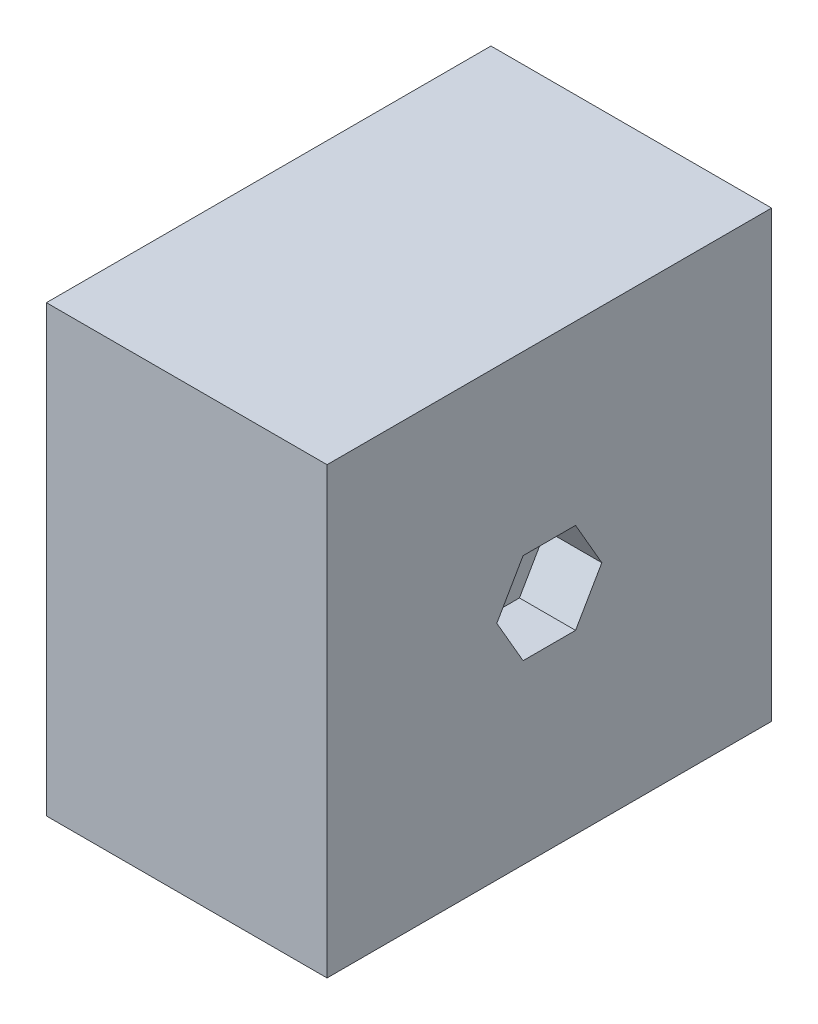
ISO-10303-21;
HEADER;
FILE_DESCRIPTION(('STEP AP214'),'2;1');
FILE_NAME('part.step','',(''),(''),'','','');
FILE_SCHEMA(('AUTOMOTIVE_DESIGN { 1 0 10303 214 1 1 1 1 }'));
ENDSEC;
DATA;
#1=APPLICATION_CONTEXT('core data for automotive mechanical design processes');
#2=APPLICATION_PROTOCOL_DEFINITION('international standard','automotive_design',2000,#1);
#3=PRODUCT_CONTEXT('',#1,'mechanical');
#4=PRODUCT('Part','Part','',(#3));
#5=PRODUCT_RELATED_PRODUCT_CATEGORY('part','',(#4));
#6=PRODUCT_DEFINITION_FORMATION('','',#4);
#7=PRODUCT_DEFINITION_CONTEXT('part definition',#1,'design');
#8=PRODUCT_DEFINITION('design','',#6,#7);
#9=PRODUCT_DEFINITION_SHAPE('','',#8);
#10=(LENGTH_UNIT() NAMED_UNIT(*) SI_UNIT(.MILLI.,.METRE.));
#11=(NAMED_UNIT(*) PLANE_ANGLE_UNIT() SI_UNIT($,.RADIAN.));
#12=(NAMED_UNIT(*) SI_UNIT($,.STERADIAN.) SOLID_ANGLE_UNIT());
#13=UNCERTAINTY_MEASURE_WITH_UNIT(LENGTH_MEASURE(1.E-05),#10,'distance_accuracy_value','');
#14=(GEOMETRIC_REPRESENTATION_CONTEXT(3) GLOBAL_UNCERTAINTY_ASSIGNED_CONTEXT((#13)) GLOBAL_UNIT_ASSIGNED_CONTEXT((#10,
#11,#12)) REPRESENTATION_CONTEXT('',''));
#15=CARTESIAN_POINT('',(0.,0.,0.));
#16=DIRECTION('',(0.,0.,1.));
#17=DIRECTION('',(1.,0.,0.));
#18=AXIS2_PLACEMENT_3D('',#15,#16,#17);
#19=CARTESIAN_POINT('',(25.,0.,0.));
#20=DIRECTION('',(1.,0.,0.));
#21=DIRECTION('',(0.,0.,-1.));
#22=AXIS2_PLACEMENT_3D('',#19,#20,#21);
#23=PLANE('',#22);
#24=DIRECTION('',(0.,1.,0.));
#25=VECTOR('',#24,1.);
#26=CARTESIAN_POINT('',(25.,19.8,-19.8));
#27=LINE('',#26,#25);
#28=CARTESIAN_POINT('',(25.,-19.8,-19.8));
#29=VERTEX_POINT('',#28);
#30=CARTESIAN_POINT('',(25.,19.8,-19.8));
#31=VERTEX_POINT('',#30);
#32=EDGE_CURVE('E222',#29,#31,#27,.T.);
#33=ORIENTED_EDGE('',*,*,#32,.T.);
#34=DIRECTION('',(0.,0.,1.));
#35=VECTOR('',#34,1.);
#36=CARTESIAN_POINT('',(25.,19.8,19.8));
#37=LINE('',#36,#35);
#38=CARTESIAN_POINT('',(25.,19.8,19.8));
#39=VERTEX_POINT('',#38);
#40=EDGE_CURVE('E225',#31,#39,#37,.T.);
#41=ORIENTED_EDGE('',*,*,#40,.T.);
#42=DIRECTION('',(0.,-1.,0.));
#43=VECTOR('',#42,1.);
#44=CARTESIAN_POINT('',(25.,19.8,19.8));
#45=LINE('',#44,#43);
#46=CARTESIAN_POINT('',(25.,-19.8,19.8));
#47=VERTEX_POINT('',#46);
#48=EDGE_CURVE('E228',#39,#47,#45,.T.);
#49=ORIENTED_EDGE('',*,*,#48,.T.);
#50=DIRECTION('',(0.,0.,-1.));
#51=VECTOR('',#50,1.);
#52=CARTESIAN_POINT('',(25.,-19.8,19.8));
#53=LINE('',#52,#51);
#54=EDGE_CURVE('E230',#47,#29,#53,.T.);
#55=ORIENTED_EDGE('',*,*,#54,.T.);
#56=EDGE_LOOP('',(#33,#41,#49,#55));
#57=FACE_BOUND('',#56,.T.);
#58=DIRECTION('',(0.,0.,1.));
#59=VECTOR('',#58,1.);
#60=CARTESIAN_POINT('',(25.,-4.05,0.));
#61=LINE('',#60,#59);
#62=CARTESIAN_POINT('',(25.,-4.05,-2.33826859021798));
#63=VERTEX_POINT('',#62);
#64=CARTESIAN_POINT('',(25.,-4.05,2.33826859021798));
#65=VERTEX_POINT('',#64);
#66=EDGE_CURVE('E167',#63,#65,#61,.T.);
#67=ORIENTED_EDGE('',*,*,#66,.T.);
#68=DIRECTION('',(0.,0.866025403784439,0.5));
#69=VECTOR('',#68,1.);
#70=CARTESIAN_POINT('',(25.,-2.025,3.50740288532698));
#71=LINE('',#70,#69);
#72=CARTESIAN_POINT('',(25.,0.,4.67653718043597));
#73=VERTEX_POINT('',#72);
#74=EDGE_CURVE('E50',#65,#73,#71,.T.);
#75=ORIENTED_EDGE('',*,*,#74,.T.);
#76=DIRECTION('',(0.,0.866025403784439,-0.5));
#77=VECTOR('',#76,1.);
#78=CARTESIAN_POINT('',(25.,2.025,3.50740288532698));
#79=LINE('',#78,#77);
#80=CARTESIAN_POINT('',(25.,4.05,2.33826859021798));
#81=VERTEX_POINT('',#80);
#82=EDGE_CURVE('E171',#73,#81,#79,.T.);
#83=ORIENTED_EDGE('',*,*,#82,.T.);
#84=DIRECTION('',(0.,0.,-1.));
#85=VECTOR('',#84,1.);
#86=CARTESIAN_POINT('',(25.,4.05,0.));
#87=LINE('',#86,#85);
#88=CARTESIAN_POINT('',(25.,4.05,-2.33826859021798));
#89=VERTEX_POINT('',#88);
#90=EDGE_CURVE('E485',#81,#89,#87,.T.);
#91=ORIENTED_EDGE('',*,*,#90,.T.);
#92=DIRECTION('',(0.,-0.866025403784439,-0.5));
#93=VECTOR('',#92,1.);
#94=CARTESIAN_POINT('',(25.,2.025,-3.50740288532698));
#95=LINE('',#94,#93);
#96=CARTESIAN_POINT('',(25.,0.,-4.67653718043597));
#97=VERTEX_POINT('',#96);
#98=EDGE_CURVE('E482',#89,#97,#95,.T.);
#99=ORIENTED_EDGE('',*,*,#98,.T.);
#100=DIRECTION('',(0.,-0.866025403784439,0.5));
#101=VECTOR('',#100,1.);
#102=CARTESIAN_POINT('',(25.,-2.025,-3.50740288532698));
#103=LINE('',#102,#101);
#104=EDGE_CURVE('E476',#97,#63,#103,.T.);
#105=ORIENTED_EDGE('',*,*,#104,.T.);
#106=EDGE_LOOP('',(#67,#75,#83,#91,#99,#105));
#107=FACE_BOUND('',#106,.T.);
#108=ADVANCED_FACE('F33',(#57,#107),#23,.T.);
#109=CARTESIAN_POINT('',(0.,0.,0.));
#110=DIRECTION('',(1.,0.,0.));
#111=DIRECTION('',(0.,0.,-1.));
#112=AXIS2_PLACEMENT_3D('',#109,#110,#111);
#113=PLANE('',#112);
#114=DIRECTION('',(0.,1.,0.));
#115=VECTOR('',#114,1.);
#116=CARTESIAN_POINT('',(0.,19.8,-19.8));
#117=LINE('',#116,#115);
#118=CARTESIAN_POINT('',(0.,-19.8,-19.8));
#119=VERTEX_POINT('',#118);
#120=CARTESIAN_POINT('',(0.,19.8,-19.8));
#121=VERTEX_POINT('',#120);
#122=EDGE_CURVE('E221',#119,#121,#117,.T.);
#123=ORIENTED_EDGE('',*,*,#122,.F.);
#124=DIRECTION('',(0.,0.,-1.));
#125=VECTOR('',#124,1.);
#126=CARTESIAN_POINT('',(0.,-19.8,19.8));
#127=LINE('',#126,#125);
#128=CARTESIAN_POINT('',(0.,-19.8,19.8));
#129=VERTEX_POINT('',#128);
#130=EDGE_CURVE('E226',#129,#119,#127,.T.);
#131=ORIENTED_EDGE('',*,*,#130,.F.);
#132=DIRECTION('',(0.,-1.,0.));
#133=VECTOR('',#132,1.);
#134=CARTESIAN_POINT('',(0.,19.8,19.8));
#135=LINE('',#134,#133);
#136=CARTESIAN_POINT('',(0.,19.8,19.8));
#137=VERTEX_POINT('',#136);
#138=EDGE_CURVE('E237',#137,#129,#135,.T.);
#139=ORIENTED_EDGE('',*,*,#138,.F.);
#140=DIRECTION('',(0.,0.,1.));
#141=VECTOR('',#140,1.);
#142=CARTESIAN_POINT('',(0.,19.8,19.8));
#143=LINE('',#142,#141);
#144=EDGE_CURVE('E235',#121,#137,#143,.T.);
#145=ORIENTED_EDGE('',*,*,#144,.F.);
#146=EDGE_LOOP('',(#123,#131,#139,#145));
#147=FACE_BOUND('',#146,.T.);
#148=DIRECTION('',(0.,0.866025403784439,-0.5));
#149=VECTOR('',#148,1.);
#150=CARTESIAN_POINT('',(0.,-4.05,-2.33826859021799));
#151=LINE('',#150,#149);
#152=CARTESIAN_POINT('',(0.,-4.05,-2.33826859021799));
#153=VERTEX_POINT('',#152);
#154=CARTESIAN_POINT('',(0.,0.,-4.67653718043597));
#155=VERTEX_POINT('',#154);
#156=EDGE_CURVE('E58',#153,#155,#151,.T.);
#157=ORIENTED_EDGE('',*,*,#156,.T.);
#158=DIRECTION('',(0.,0.866025403784438,0.5));
#159=VECTOR('',#158,1.);
#160=CARTESIAN_POINT('',(0.,0.,-4.67653718043597));
#161=LINE('',#160,#159);
#162=CARTESIAN_POINT('',(0.,4.05,-2.33826859021798));
#163=VERTEX_POINT('',#162);
#164=EDGE_CURVE('E196',#155,#163,#161,.T.);
#165=ORIENTED_EDGE('',*,*,#164,.T.);
#166=DIRECTION('',(0.,0.,1.));
#167=VECTOR('',#166,1.);
#168=CARTESIAN_POINT('',(0.,4.05,-2.33826859021798));
#169=LINE('',#168,#167);
#170=CARTESIAN_POINT('',(0.,4.05,2.33826859021798));
#171=VERTEX_POINT('',#170);
#172=EDGE_CURVE('E199',#163,#171,#169,.T.);
#173=ORIENTED_EDGE('',*,*,#172,.T.);
#174=DIRECTION('',(0.,-0.866025403784439,0.5));
#175=VECTOR('',#174,1.);
#176=CARTESIAN_POINT('',(0.,4.05,2.33826859021798));
#177=LINE('',#176,#175);
#178=CARTESIAN_POINT('',(0.,0.,4.67653718043597));
#179=VERTEX_POINT('',#178);
#180=EDGE_CURVE('E202',#171,#179,#177,.T.);
#181=ORIENTED_EDGE('',*,*,#180,.T.);
#182=DIRECTION('',(0.,-0.866025403784438,-0.5));
#183=VECTOR('',#182,1.);
#184=CARTESIAN_POINT('',(0.,0.,4.67653718043597));
#185=LINE('',#184,#183);
#186=CARTESIAN_POINT('',(0.,-4.05,2.33826859021798));
#187=VERTEX_POINT('',#186);
#188=EDGE_CURVE('E205',#179,#187,#185,.T.);
#189=ORIENTED_EDGE('',*,*,#188,.T.);
#190=DIRECTION('',(0.,0.,-1.));
#191=VECTOR('',#190,1.);
#192=CARTESIAN_POINT('',(0.,-4.05,2.33826859021798));
#193=LINE('',#192,#191);
#194=EDGE_CURVE('E184',#187,#153,#193,.T.);
#195=ORIENTED_EDGE('',*,*,#194,.T.);
#196=EDGE_LOOP('',(#157,#165,#173,#181,#189,#195));
#197=FACE_BOUND('',#196,.T.);
#198=ADVANCED_FACE('F265',(#147,#197),#113,.F.);
#199=CARTESIAN_POINT('',(25.,19.8,-19.8));
#200=DIRECTION('',(0.,0.,1.));
#201=DIRECTION('',(0.,-1.,0.));
#202=AXIS2_PLACEMENT_3D('',#199,#200,#201);
#203=PLANE('',#202);
#204=ORIENTED_EDGE('',*,*,#122,.T.);
#205=DIRECTION('',(-1.,0.,0.));
#206=VECTOR('',#205,1.);
#207=CARTESIAN_POINT('',(25.,19.8,-19.8));
#208=LINE('',#207,#206);
#209=EDGE_CURVE('E11',#31,#121,#208,.T.);
#210=ORIENTED_EDGE('',*,*,#209,.F.);
#211=ORIENTED_EDGE('',*,*,#32,.F.);
#212=DIRECTION('',(-1.,0.,0.));
#213=VECTOR('',#212,1.);
#214=CARTESIAN_POINT('',(25.,-19.8,-19.8));
#215=LINE('',#214,#213);
#216=EDGE_CURVE('E232',#29,#119,#215,.T.);
#217=ORIENTED_EDGE('',*,*,#216,.T.);
#218=EDGE_LOOP('',(#204,#210,#211,#217));
#219=FACE_BOUND('',#218,.T.);
#220=ADVANCED_FACE('F35',(#219),#203,.F.);
#221=CARTESIAN_POINT('',(25.,19.8,19.8));
#222=DIRECTION('',(0.,-1.,0.));
#223=DIRECTION('',(0.,0.,-1.));
#224=AXIS2_PLACEMENT_3D('',#221,#222,#223);
#225=PLANE('',#224);
#226=ORIENTED_EDGE('',*,*,#144,.T.);
#227=DIRECTION('',(-1.,0.,0.));
#228=VECTOR('',#227,1.);
#229=CARTESIAN_POINT('',(25.,19.8,19.8));
#230=LINE('',#229,#228);
#231=EDGE_CURVE('E42',#39,#137,#230,.T.);
#232=ORIENTED_EDGE('',*,*,#231,.F.);
#233=ORIENTED_EDGE('',*,*,#40,.F.);
#234=ORIENTED_EDGE('',*,*,#209,.T.);
#235=EDGE_LOOP('',(#226,#232,#233,#234));
#236=FACE_BOUND('',#235,.T.);
#237=ADVANCED_FACE('F284',(#236),#225,.F.);
#238=CARTESIAN_POINT('',(25.,19.8,19.8));
#239=DIRECTION('',(0.,0.,-1.));
#240=DIRECTION('',(0.,1.,0.));
#241=AXIS2_PLACEMENT_3D('',#238,#239,#240);
#242=PLANE('',#241);
#243=ORIENTED_EDGE('',*,*,#138,.T.);
#244=DIRECTION('',(-1.,0.,0.));
#245=VECTOR('',#244,1.);
#246=CARTESIAN_POINT('',(25.,-19.8,19.8));
#247=LINE('',#246,#245);
#248=EDGE_CURVE('E242',#47,#129,#247,.T.);
#249=ORIENTED_EDGE('',*,*,#248,.F.);
#250=ORIENTED_EDGE('',*,*,#48,.F.);
#251=ORIENTED_EDGE('',*,*,#231,.T.);
#252=EDGE_LOOP('',(#243,#249,#250,#251));
#253=FACE_BOUND('',#252,.T.);
#254=ADVANCED_FACE('F281',(#253),#242,.F.);
#255=CARTESIAN_POINT('',(25.,-19.8,19.8));
#256=DIRECTION('',(0.,1.,0.));
#257=DIRECTION('',(0.,0.,1.));
#258=AXIS2_PLACEMENT_3D('',#255,#256,#257);
#259=PLANE('',#258);
#260=ORIENTED_EDGE('',*,*,#130,.T.);
#261=ORIENTED_EDGE('',*,*,#216,.F.);
#262=ORIENTED_EDGE('',*,*,#54,.F.);
#263=ORIENTED_EDGE('',*,*,#248,.T.);
#264=EDGE_LOOP('',(#260,#261,#262,#263));
#265=FACE_BOUND('',#264,.T.);
#266=ADVANCED_FACE('F278',(#265),#259,.F.);
#267=CARTESIAN_POINT('',(5.,-4.05,-2.33826859021799));
#268=DIRECTION('',(0.,0.5,0.866025403784439));
#269=DIRECTION('',(0.,-0.866025403784439,0.5));
#270=AXIS2_PLACEMENT_3D('',#267,#268,#269);
#271=PLANE('',#270);
#272=ORIENTED_EDGE('',*,*,#156,.F.);
#273=DIRECTION('',(-1.,0.,0.));
#274=VECTOR('',#273,1.);
#275=CARTESIAN_POINT('',(5.,-4.05,-2.33826859021799));
#276=LINE('',#275,#274);
#277=CARTESIAN_POINT('',(5.,-4.05,-2.33826859021799));
#278=VERTEX_POINT('',#277);
#279=EDGE_CURVE('E194',#278,#153,#276,.T.);
#280=ORIENTED_EDGE('',*,*,#279,.F.);
#281=DIRECTION('',(0.,0.866025403784439,-0.5));
#282=VECTOR('',#281,1.);
#283=CARTESIAN_POINT('',(5.,-4.05,-2.33826859021799));
#284=LINE('',#283,#282);
#285=CARTESIAN_POINT('',(5.,0.,-4.67653718043597));
#286=VERTEX_POINT('',#285);
#287=EDGE_CURVE('E180',#278,#286,#284,.T.);
#288=ORIENTED_EDGE('',*,*,#287,.T.);
#289=DIRECTION('',(-1.,0.,0.));
#290=VECTOR('',#289,1.);
#291=CARTESIAN_POINT('',(5.,0.,-4.67653718043597));
#292=LINE('',#291,#290);
#293=EDGE_CURVE('E219',#286,#155,#292,.T.);
#294=ORIENTED_EDGE('',*,*,#293,.T.);
#295=EDGE_LOOP('',(#272,#280,#288,#294));
#296=FACE_BOUND('',#295,.T.);
#297=ADVANCED_FACE('F275',(#296),#271,.T.);
#298=CARTESIAN_POINT('',(5.,0.,-4.67653718043597));
#299=DIRECTION('',(0.,-0.5,0.866025403784438));
#300=DIRECTION('',(0.,-0.866025403784438,-0.5));
#301=AXIS2_PLACEMENT_3D('',#298,#299,#300);
#302=PLANE('',#301);
#303=ORIENTED_EDGE('',*,*,#164,.F.);
#304=ORIENTED_EDGE('',*,*,#293,.F.);
#305=DIRECTION('',(0.,0.866025403784438,0.5));
#306=VECTOR('',#305,1.);
#307=CARTESIAN_POINT('',(5.,0.,-4.67653718043597));
#308=LINE('',#307,#306);
#309=CARTESIAN_POINT('',(5.,4.05,-2.33826859021798));
#310=VERTEX_POINT('',#309);
#311=EDGE_CURVE('E183',#286,#310,#308,.T.);
#312=ORIENTED_EDGE('',*,*,#311,.T.);
#313=DIRECTION('',(-1.,0.,0.));
#314=VECTOR('',#313,1.);
#315=CARTESIAN_POINT('',(5.,4.05,-2.33826859021798));
#316=LINE('',#315,#314);
#317=EDGE_CURVE('E217',#310,#163,#316,.T.);
#318=ORIENTED_EDGE('',*,*,#317,.T.);
#319=EDGE_LOOP('',(#303,#304,#312,#318));
#320=FACE_BOUND('',#319,.T.);
#321=ADVANCED_FACE('F315',(#320),#302,.T.);
#322=CARTESIAN_POINT('',(5.,4.05,-2.33826859021798));
#323=DIRECTION('',(0.,-1.,0.));
#324=DIRECTION('',(0.,0.,-1.));
#325=AXIS2_PLACEMENT_3D('',#322,#323,#324);
#326=PLANE('',#325);
#327=ORIENTED_EDGE('',*,*,#172,.F.);
#328=ORIENTED_EDGE('',*,*,#317,.F.);
#329=DIRECTION('',(0.,0.,1.));
#330=VECTOR('',#329,1.);
#331=CARTESIAN_POINT('',(5.,4.05,-2.33826859021798));
#332=LINE('',#331,#330);
#333=CARTESIAN_POINT('',(5.,4.05,2.33826859021798));
#334=VERTEX_POINT('',#333);
#335=EDGE_CURVE('E186',#310,#334,#332,.T.);
#336=ORIENTED_EDGE('',*,*,#335,.T.);
#337=DIRECTION('',(-1.,0.,0.));
#338=VECTOR('',#337,1.);
#339=CARTESIAN_POINT('',(5.,4.05,2.33826859021798));
#340=LINE('',#339,#338);
#341=EDGE_CURVE('E215',#334,#171,#340,.T.);
#342=ORIENTED_EDGE('',*,*,#341,.T.);
#343=EDGE_LOOP('',(#327,#328,#336,#342));
#344=FACE_BOUND('',#343,.T.);
#345=ADVANCED_FACE('F318',(#344),#326,.T.);
#346=CARTESIAN_POINT('',(5.,4.05,2.33826859021798));
#347=DIRECTION('',(0.,-0.5,-0.866025403784439));
#348=DIRECTION('',(0.,0.866025403784439,-0.5));
#349=AXIS2_PLACEMENT_3D('',#346,#347,#348);
#350=PLANE('',#349);
#351=ORIENTED_EDGE('',*,*,#180,.F.);
#352=ORIENTED_EDGE('',*,*,#341,.F.);
#353=DIRECTION('',(0.,-0.866025403784439,0.5));
#354=VECTOR('',#353,1.);
#355=CARTESIAN_POINT('',(5.,4.05,2.33826859021798));
#356=LINE('',#355,#354);
#357=CARTESIAN_POINT('',(5.,0.,4.67653718043597));
#358=VERTEX_POINT('',#357);
#359=EDGE_CURVE('E188',#334,#358,#356,.T.);
#360=ORIENTED_EDGE('',*,*,#359,.T.);
#361=DIRECTION('',(-1.,0.,0.));
#362=VECTOR('',#361,1.);
#363=CARTESIAN_POINT('',(5.,0.,4.67653718043597));
#364=LINE('',#363,#362);
#365=EDGE_CURVE('E213',#358,#179,#364,.T.);
#366=ORIENTED_EDGE('',*,*,#365,.T.);
#367=EDGE_LOOP('',(#351,#352,#360,#366));
#368=FACE_BOUND('',#367,.T.);
#369=ADVANCED_FACE('F322',(#368),#350,.T.);
#370=CARTESIAN_POINT('',(5.,0.,4.67653718043597));
#371=DIRECTION('',(0.,0.5,-0.866025403784438));
#372=DIRECTION('',(0.,0.866025403784439,0.5));
#373=AXIS2_PLACEMENT_3D('',#370,#371,#372);
#374=PLANE('',#373);
#375=ORIENTED_EDGE('',*,*,#188,.F.);
#376=ORIENTED_EDGE('',*,*,#365,.F.);
#377=DIRECTION('',(0.,-0.866025403784438,-0.5));
#378=VECTOR('',#377,1.);
#379=CARTESIAN_POINT('',(5.,0.,4.67653718043597));
#380=LINE('',#379,#378);
#381=CARTESIAN_POINT('',(5.,-4.05,2.33826859021798));
#382=VERTEX_POINT('',#381);
#383=EDGE_CURVE('E190',#358,#382,#380,.T.);
#384=ORIENTED_EDGE('',*,*,#383,.T.);
#385=DIRECTION('',(-1.,0.,0.));
#386=VECTOR('',#385,1.);
#387=CARTESIAN_POINT('',(5.,-4.05,2.33826859021798));
#388=LINE('',#387,#386);
#389=EDGE_CURVE('E211',#382,#187,#388,.T.);
#390=ORIENTED_EDGE('',*,*,#389,.T.);
#391=EDGE_LOOP('',(#375,#376,#384,#390));
#392=FACE_BOUND('',#391,.T.);
#393=ADVANCED_FACE('F325',(#392),#374,.T.);
#394=CARTESIAN_POINT('',(5.,-4.05,2.33826859021798));
#395=DIRECTION('',(0.,1.,0.));
#396=DIRECTION('',(0.,0.,1.));
#397=AXIS2_PLACEMENT_3D('',#394,#395,#396);
#398=PLANE('',#397);
#399=ORIENTED_EDGE('',*,*,#194,.F.);
#400=ORIENTED_EDGE('',*,*,#389,.F.);
#401=DIRECTION('',(0.,0.,-1.));
#402=VECTOR('',#401,1.);
#403=CARTESIAN_POINT('',(5.,-4.05,2.33826859021798));
#404=LINE('',#403,#402);
#405=EDGE_CURVE('E192',#382,#278,#404,.T.);
#406=ORIENTED_EDGE('',*,*,#405,.T.);
#407=ORIENTED_EDGE('',*,*,#279,.T.);
#408=EDGE_LOOP('',(#399,#400,#406,#407));
#409=FACE_BOUND('',#408,.T.);
#410=ADVANCED_FACE('F261',(#409),#398,.T.);
#411=CARTESIAN_POINT('',(5.,0.,0.));
#412=DIRECTION('',(1.,0.,0.));
#413=DIRECTION('',(0.,0.,-1.));
#414=AXIS2_PLACEMENT_3D('',#411,#412,#413);
#415=PLANE('',#414);
#416=CARTESIAN_POINT('',(5.,0.,0.));
#417=DIRECTION('',(1.,0.,0.));
#418=DIRECTION('',(0.,0.,-1.));
#419=AXIS2_PLACEMENT_3D('',#416,#417,#418);
#420=CIRCLE('',#419,2.75);
#421=CARTESIAN_POINT('',(5.,0.,-2.75));
#422=VERTEX_POINT('',#421);
#423=EDGE_CURVE('E175',#422,#422,#420,.T.);
#424=ORIENTED_EDGE('',*,*,#423,.T.);
#425=EDGE_LOOP('',(#424));
#426=FACE_BOUND('',#425,.T.);
#427=ORIENTED_EDGE('',*,*,#287,.F.);
#428=ORIENTED_EDGE('',*,*,#405,.F.);
#429=ORIENTED_EDGE('',*,*,#383,.F.);
#430=ORIENTED_EDGE('',*,*,#359,.F.);
#431=ORIENTED_EDGE('',*,*,#335,.F.);
#432=ORIENTED_EDGE('',*,*,#311,.F.);
#433=EDGE_LOOP('',(#427,#428,#429,#430,#431,#432));
#434=FACE_BOUND('',#433,.T.);
#435=ADVANCED_FACE('F249',(#426,#434),#415,.F.);
#436=CARTESIAN_POINT('',(-1.2E-05,0.,0.));
#437=DIRECTION('',(1.,0.,0.));
#438=DIRECTION('',(0.,0.,-1.));
#439=AXIS2_PLACEMENT_3D('',#436,#437,#438);
#440=CYLINDRICAL_SURFACE('',#439,2.75);
#441=CARTESIAN_POINT('',(20.,0.,0.));
#442=DIRECTION('',(-1.,0.,0.));
#443=DIRECTION('',(0.,0.,1.));
#444=AXIS2_PLACEMENT_3D('',#441,#442,#443);
#445=CIRCLE('',#444,2.75);
#446=CARTESIAN_POINT('',(20.,0.,-2.75));
#447=VERTEX_POINT('',#446);
#448=EDGE_CURVE('E37',#447,#447,#445,.F.);
#449=CARTESIAN_POINT('',(20.,0.,-2.75));
#450=CARTESIAN_POINT('',(19.84375,0.,-2.75));
#451=CARTESIAN_POINT('',(19.6875,0.,-2.75));
#452=CARTESIAN_POINT('',(19.375,0.,-2.75));
#453=CARTESIAN_POINT('',(19.21875,0.,-2.75));
#454=CARTESIAN_POINT('',(18.90625,0.,-2.75));
#455=CARTESIAN_POINT('',(18.75,0.,-2.75));
#456=CARTESIAN_POINT('',(18.4375,0.,-2.75));
#457=CARTESIAN_POINT('',(18.28125,0.,-2.75));
#458=CARTESIAN_POINT('',(17.96875,0.,-2.75));
#459=CARTESIAN_POINT('',(17.8125,0.,-2.75));
#460=CARTESIAN_POINT('',(17.5,0.,-2.75));
#461=CARTESIAN_POINT('',(17.34375,0.,-2.75));
#462=CARTESIAN_POINT('',(17.03125,0.,-2.75));
#463=CARTESIAN_POINT('',(16.875,0.,-2.75));
#464=CARTESIAN_POINT('',(16.5625,0.,-2.75));
#465=CARTESIAN_POINT('',(16.40625,0.,-2.75));
#466=CARTESIAN_POINT('',(16.09375,0.,-2.75));
#467=CARTESIAN_POINT('',(15.9375,0.,-2.75));
#468=CARTESIAN_POINT('',(15.625,0.,-2.75));
#469=CARTESIAN_POINT('',(15.46875,0.,-2.75));
#470=CARTESIAN_POINT('',(15.15625,0.,-2.75));
#471=CARTESIAN_POINT('',(15.,0.,-2.75));
#472=CARTESIAN_POINT('',(14.6875,0.,-2.75));
#473=CARTESIAN_POINT('',(14.53125,0.,-2.75));
#474=CARTESIAN_POINT('',(14.21875,0.,-2.75));
#475=CARTESIAN_POINT('',(14.0625,0.,-2.75));
#476=CARTESIAN_POINT('',(13.75,0.,-2.75));
#477=CARTESIAN_POINT('',(13.59375,0.,-2.75));
#478=CARTESIAN_POINT('',(13.28125,0.,-2.75));
#479=CARTESIAN_POINT('',(13.125,0.,-2.75));
#480=CARTESIAN_POINT('',(12.8125,0.,-2.75));
#481=CARTESIAN_POINT('',(12.65625,0.,-2.75));
#482=CARTESIAN_POINT('',(12.34375,0.,-2.75));
#483=CARTESIAN_POINT('',(12.1875,0.,-2.75));
#484=CARTESIAN_POINT('',(11.875,0.,-2.75));
#485=CARTESIAN_POINT('',(11.71875,0.,-2.75));
#486=CARTESIAN_POINT('',(11.40625,0.,-2.75));
#487=CARTESIAN_POINT('',(11.25,0.,-2.75));
#488=CARTESIAN_POINT('',(10.9375,0.,-2.75));
#489=CARTESIAN_POINT('',(10.78125,0.,-2.75));
#490=CARTESIAN_POINT('',(10.46875,0.,-2.75));
#491=CARTESIAN_POINT('',(10.3125,0.,-2.75));
#492=CARTESIAN_POINT('',(10.,0.,-2.75));
#493=CARTESIAN_POINT('',(9.84375,0.,-2.75));
#494=CARTESIAN_POINT('',(9.53125,0.,-2.75));
#495=CARTESIAN_POINT('',(9.375,0.,-2.75));
#496=CARTESIAN_POINT('',(9.0625,0.,-2.75));
#497=CARTESIAN_POINT('',(8.90625,0.,-2.75));
#498=CARTESIAN_POINT('',(8.59375,0.,-2.75));
#499=CARTESIAN_POINT('',(8.4375,0.,-2.75));
#500=CARTESIAN_POINT('',(8.125,0.,-2.75));
#501=CARTESIAN_POINT('',(7.96875,0.,-2.75));
#502=CARTESIAN_POINT('',(7.65625,0.,-2.75));
#503=CARTESIAN_POINT('',(7.5,0.,-2.75));
#504=CARTESIAN_POINT('',(7.1875,0.,-2.75));
#505=CARTESIAN_POINT('',(7.03125,0.,-2.75));
#506=CARTESIAN_POINT('',(6.71875,0.,-2.75));
#507=CARTESIAN_POINT('',(6.5625,0.,-2.75));
#508=CARTESIAN_POINT('',(6.25,0.,-2.75));
#509=CARTESIAN_POINT('',(6.09375,0.,-2.75));
#510=CARTESIAN_POINT('',(5.78125,0.,-2.75));
#511=CARTESIAN_POINT('',(5.625,0.,-2.75));
#512=CARTESIAN_POINT('',(5.3125,0.,-2.75));
#513=CARTESIAN_POINT('',(5.15625,0.,-2.75));
#514=CARTESIAN_POINT('',(5.,0.,-2.75));
#515=B_SPLINE_CURVE_WITH_KNOTS('',3,(#449,#450,#451,#452,#453,#454,#455,#456,#457,#458,#459,
#460,#461,#462,#463,#464,#465,#466,#467,#468,#469,#470,#471,#472,#473,#474,#475,#476,#477,#478,
#479,#480,#481,#482,#483,#484,#485,#486,#487,#488,#489,#490,#491,#492,#493,#494,#495,#496,#497,
#498,#499,#500,#501,#502,#503,#504,#505,#506,#507,#508,#509,#510,#511,#512,#513,#514),
.UNSPECIFIED.,.F.,.F.,(4,2,2,2,2,2,2,2,2,2,2,2,2,2,2,2,2,2,2,2,2,2,2,2,2,2,2,2,2,2,2,2,4),(0.,
0.46875,0.937500000000001,1.40625,1.875,2.34375,2.8125,3.28125,3.75,4.21875,4.6875,5.15625,
5.625,6.09375,6.5625,7.03125,7.5,7.96875,8.4375,8.90625,9.375,9.84375,10.3125,10.78125,11.25,
11.71875,12.1875,12.65625,13.125,13.59375,14.0625,14.53125,15.),.UNSPECIFIED.);
#516=EDGE_CURVE('BSEAM252',#447,#422,#515,.T.);
#517=ORIENTED_EDGE('',*,*,#448,.T.);
#518=ORIENTED_EDGE('',*,*,#423,.F.);
#519=ORIENTED_EDGE('',*,*,#516,.T.);
#520=ORIENTED_EDGE('',*,*,#516,.F.);
#521=EDGE_LOOP('',(#517,#519,#518,#520));
#522=FACE_BOUND('',#521,.T.);
#523=ADVANCED_FACE('F252',(#522),#440,.F.);
#524=CARTESIAN_POINT('',(20.,0.,0.));
#525=DIRECTION('',(-1.,0.,0.));
#526=DIRECTION('',(0.,0.,1.));
#527=AXIS2_PLACEMENT_3D('',#524,#525,#526);
#528=PLANE('',#527);
#529=DIRECTION('',(0.,0.866025403784439,0.5));
#530=VECTOR('',#529,1.);
#531=CARTESIAN_POINT('',(20.,-2.025,3.50740288532698));
#532=LINE('',#531,#530);
#533=CARTESIAN_POINT('',(20.,-4.05,2.33826859021798));
#534=VERTEX_POINT('',#533);
#535=CARTESIAN_POINT('',(20.,0.,4.67653718043597));
#536=VERTEX_POINT('',#535);
#537=EDGE_CURVE('E157',#534,#536,#532,.T.);
#538=ORIENTED_EDGE('',*,*,#537,.F.);
#539=DIRECTION('',(0.,0.,1.));
#540=VECTOR('',#539,1.);
#541=CARTESIAN_POINT('',(20.,-4.05,0.));
#542=LINE('',#541,#540);
#543=CARTESIAN_POINT('',(20.,-4.05,-2.33826859021798));
#544=VERTEX_POINT('',#543);
#545=EDGE_CURVE('E490',#544,#534,#542,.T.);
#546=ORIENTED_EDGE('',*,*,#545,.F.);
#547=DIRECTION('',(0.,-0.866025403784439,0.5));
#548=VECTOR('',#547,1.);
#549=CARTESIAN_POINT('',(20.,-2.025,-3.50740288532698));
#550=LINE('',#549,#548);
#551=CARTESIAN_POINT('',(20.,0.,-4.67653718043597));
#552=VERTEX_POINT('',#551);
#553=EDGE_CURVE('E499',#552,#544,#550,.T.);
#554=ORIENTED_EDGE('',*,*,#553,.F.);
#555=DIRECTION('',(0.,-0.866025403784439,-0.5));
#556=VECTOR('',#555,1.);
#557=CARTESIAN_POINT('',(20.,2.025,-3.50740288532698));
#558=LINE('',#557,#556);
#559=CARTESIAN_POINT('',(20.,4.05,-2.33826859021798));
#560=VERTEX_POINT('',#559);
#561=EDGE_CURVE('E501',#560,#552,#558,.T.);
#562=ORIENTED_EDGE('',*,*,#561,.F.);
#563=DIRECTION('',(0.,0.,-1.));
#564=VECTOR('',#563,1.);
#565=CARTESIAN_POINT('',(20.,4.05,0.));
#566=LINE('',#565,#564);
#567=CARTESIAN_POINT('',(20.,4.05,2.33826859021798));
#568=VERTEX_POINT('',#567);
#569=EDGE_CURVE('E159',#568,#560,#566,.T.);
#570=ORIENTED_EDGE('',*,*,#569,.F.);
#571=DIRECTION('',(0.,0.866025403784439,-0.5));
#572=VECTOR('',#571,1.);
#573=CARTESIAN_POINT('',(20.,2.025,3.50740288532698));
#574=LINE('',#573,#572);
#575=EDGE_CURVE('E152',#536,#568,#574,.T.);
#576=ORIENTED_EDGE('',*,*,#575,.F.);
#577=EDGE_LOOP('',(#538,#546,#554,#562,#570,#576));
#578=FACE_BOUND('',#577,.T.);
#579=ORIENTED_EDGE('',*,*,#448,.F.);
#580=EDGE_LOOP('',(#579));
#581=FACE_BOUND('',#580,.T.);
#582=ADVANCED_FACE('F154',(#578,#581),#528,.F.);
#583=CARTESIAN_POINT('',(20.,-2.025,3.50740288532698));
#584=DIRECTION('',(0.,0.5,-0.866025403784438));
#585=DIRECTION('',(0.,0.866025403784438,0.5));
#586=AXIS2_PLACEMENT_3D('',#583,#584,#585);
#587=PLANE('',#586);
#588=ORIENTED_EDGE('',*,*,#74,.F.);
#589=DIRECTION('',(1.,0.,0.));
#590=VECTOR('',#589,1.);
#591=CARTESIAN_POINT('',(20.,-4.05,2.33826859021798));
#592=LINE('',#591,#590);
#593=EDGE_CURVE('E166',#534,#65,#592,.T.);
#594=ORIENTED_EDGE('',*,*,#593,.F.);
#595=ORIENTED_EDGE('',*,*,#537,.T.);
#596=DIRECTION('',(1.,0.,0.));
#597=VECTOR('',#596,1.);
#598=CARTESIAN_POINT('',(20.,0.,4.67653718043597));
#599=LINE('',#598,#597);
#600=EDGE_CURVE('E165',#536,#73,#599,.T.);
#601=ORIENTED_EDGE('',*,*,#600,.T.);
#602=EDGE_LOOP('',(#588,#594,#595,#601));
#603=FACE_BOUND('',#602,.T.);
#604=ADVANCED_FACE('F164',(#603),#587,.T.);
#605=CARTESIAN_POINT('',(20.,2.025,3.50740288532698));
#606=DIRECTION('',(0.,-0.5,-0.866025403784439));
#607=DIRECTION('',(0.,0.866025403784439,-0.5));
#608=AXIS2_PLACEMENT_3D('',#605,#606,#607);
#609=PLANE('',#608);
#610=ORIENTED_EDGE('',*,*,#82,.F.);
#611=ORIENTED_EDGE('',*,*,#600,.F.);
#612=ORIENTED_EDGE('',*,*,#575,.T.);
#613=DIRECTION('',(1.,0.,0.));
#614=VECTOR('',#613,1.);
#615=CARTESIAN_POINT('',(20.,4.05,2.33826859021798));
#616=LINE('',#615,#614);
#617=EDGE_CURVE('E172',#568,#81,#616,.T.);
#618=ORIENTED_EDGE('',*,*,#617,.T.);
#619=EDGE_LOOP('',(#610,#611,#612,#618));
#620=FACE_BOUND('',#619,.T.);
#621=ADVANCED_FACE('F169',(#620),#609,.T.);
#622=CARTESIAN_POINT('',(20.,4.05,0.));
#623=DIRECTION('',(0.,-1.,0.));
#624=DIRECTION('',(0.,0.,-1.));
#625=AXIS2_PLACEMENT_3D('',#622,#623,#624);
#626=PLANE('',#625);
#627=ORIENTED_EDGE('',*,*,#90,.F.);
#628=ORIENTED_EDGE('',*,*,#617,.F.);
#629=ORIENTED_EDGE('',*,*,#569,.T.);
#630=DIRECTION('',(1.,0.,0.));
#631=VECTOR('',#630,1.);
#632=CARTESIAN_POINT('',(20.,4.05,-2.33826859021798));
#633=LINE('',#632,#631);
#634=EDGE_CURVE('E176',#560,#89,#633,.T.);
#635=ORIENTED_EDGE('',*,*,#634,.T.);
#636=EDGE_LOOP('',(#627,#628,#629,#635));
#637=FACE_BOUND('',#636,.T.);
#638=ADVANCED_FACE('F427',(#637),#626,.T.);
#639=CARTESIAN_POINT('',(20.,2.025,-3.50740288532698));
#640=DIRECTION('',(0.,-0.5,0.866025403784438));
#641=DIRECTION('',(0.,-0.866025403784438,-0.5));
#642=AXIS2_PLACEMENT_3D('',#639,#640,#641);
#643=PLANE('',#642);
#644=ORIENTED_EDGE('',*,*,#98,.F.);
#645=ORIENTED_EDGE('',*,*,#634,.F.);
#646=ORIENTED_EDGE('',*,*,#561,.T.);
#647=DIRECTION('',(1.,0.,0.));
#648=VECTOR('',#647,1.);
#649=CARTESIAN_POINT('',(20.,0.,-4.67653718043597));
#650=LINE('',#649,#648);
#651=EDGE_CURVE('E492',#552,#97,#650,.T.);
#652=ORIENTED_EDGE('',*,*,#651,.T.);
#653=EDGE_LOOP('',(#644,#645,#646,#652));
#654=FACE_BOUND('',#653,.T.);
#655=ADVANCED_FACE('F435',(#654),#643,.T.);
#656=CARTESIAN_POINT('',(20.,-2.025,-3.50740288532698));
#657=DIRECTION('',(0.,0.5,0.866025403784439));
#658=DIRECTION('',(0.,-0.866025403784439,0.5));
#659=AXIS2_PLACEMENT_3D('',#656,#657,#658);
#660=PLANE('',#659);
#661=ORIENTED_EDGE('',*,*,#104,.F.);
#662=ORIENTED_EDGE('',*,*,#651,.F.);
#663=ORIENTED_EDGE('',*,*,#553,.T.);
#664=DIRECTION('',(1.,0.,0.));
#665=VECTOR('',#664,1.);
#666=CARTESIAN_POINT('',(20.,-4.05,-2.33826859021798));
#667=LINE('',#666,#665);
#668=EDGE_CURVE('E475',#544,#63,#667,.T.);
#669=ORIENTED_EDGE('',*,*,#668,.T.);
#670=EDGE_LOOP('',(#661,#662,#663,#669));
#671=FACE_BOUND('',#670,.T.);
#672=ADVANCED_FACE('F444',(#671),#660,.T.);
#673=CARTESIAN_POINT('',(20.,-4.05,0.));
#674=DIRECTION('',(0.,1.,0.));
#675=DIRECTION('',(0.,0.,1.));
#676=AXIS2_PLACEMENT_3D('',#673,#674,#675);
#677=PLANE('',#676);
#678=ORIENTED_EDGE('',*,*,#66,.F.);
#679=ORIENTED_EDGE('',*,*,#668,.F.);
#680=ORIENTED_EDGE('',*,*,#545,.T.);
#681=ORIENTED_EDGE('',*,*,#593,.T.);
#682=EDGE_LOOP('',(#678,#679,#680,#681));
#683=FACE_BOUND('',#682,.T.);
#684=ADVANCED_FACE('F453',(#683),#677,.T.);
#685=CLOSED_SHELL('',(#108,#198,#220,#237,#254,#266,#297,#321,#345,#369,#393,#410,#435,#523,
#582,#604,#621,#638,#655,#672,#684));
#686=MANIFOLD_SOLID_BREP('B2',#685);
#687=ADVANCED_BREP_SHAPE_REPRESENTATION('',(#18,#686),#14);
#688=SHAPE_DEFINITION_REPRESENTATION(#9,#687);
ENDSEC;
END-ISO-10303-21;
